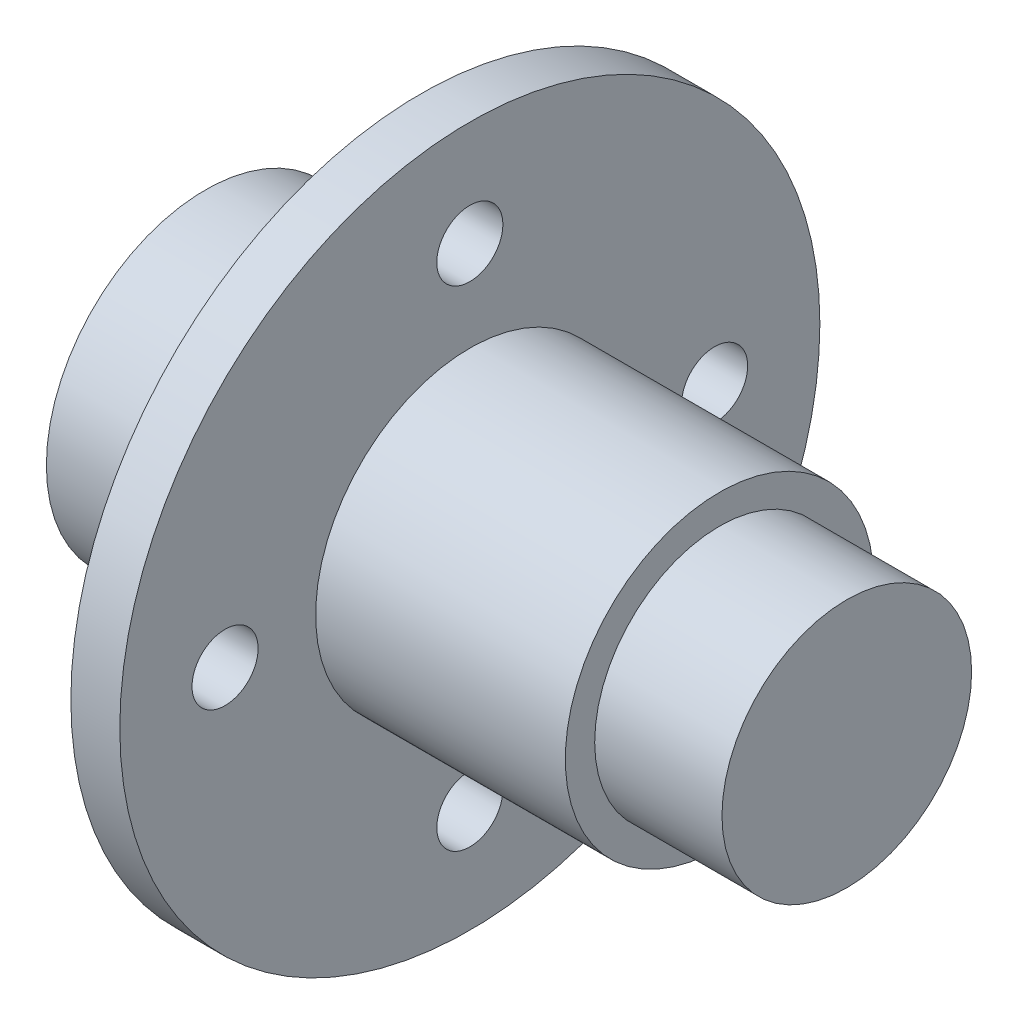
ISO-10303-21;
HEADER;
FILE_DESCRIPTION(('STEP AP214'),'2;1');
FILE_NAME('part.step','',(''),(''),'','','');
FILE_SCHEMA(('AUTOMOTIVE_DESIGN { 1 0 10303 214 1 1 1 1 }'));
ENDSEC;
DATA;
#1=APPLICATION_CONTEXT('core data for automotive mechanical design processes');
#2=APPLICATION_PROTOCOL_DEFINITION('international standard','automotive_design',2000,#1);
#3=PRODUCT_CONTEXT('',#1,'mechanical');
#4=PRODUCT('Part','Part','',(#3));
#5=PRODUCT_RELATED_PRODUCT_CATEGORY('part','',(#4));
#6=PRODUCT_DEFINITION_FORMATION('','',#4);
#7=PRODUCT_DEFINITION_CONTEXT('part definition',#1,'design');
#8=PRODUCT_DEFINITION('design','',#6,#7);
#9=PRODUCT_DEFINITION_SHAPE('','',#8);
#10=(LENGTH_UNIT() NAMED_UNIT(*) SI_UNIT(.MILLI.,.METRE.));
#11=(NAMED_UNIT(*) PLANE_ANGLE_UNIT() SI_UNIT($,.RADIAN.));
#12=(NAMED_UNIT(*) SI_UNIT($,.STERADIAN.) SOLID_ANGLE_UNIT());
#13=UNCERTAINTY_MEASURE_WITH_UNIT(LENGTH_MEASURE(1.E-05),#10,'distance_accuracy_value','');
#14=(GEOMETRIC_REPRESENTATION_CONTEXT(3) GLOBAL_UNCERTAINTY_ASSIGNED_CONTEXT((#13)) GLOBAL_UNIT_ASSIGNED_CONTEXT((#10,
#11,#12)) REPRESENTATION_CONTEXT('',''));
#15=CARTESIAN_POINT('',(0.,0.,0.));
#16=DIRECTION('',(0.,0.,1.));
#17=DIRECTION('',(1.,0.,0.));
#18=AXIS2_PLACEMENT_3D('',#15,#16,#17);
#19=CARTESIAN_POINT('',(-32.4772160216162,0.,0.));
#20=DIRECTION('',(-1.,0.,0.));
#21=DIRECTION('',(0.,0.,1.));
#22=AXIS2_PLACEMENT_3D('',#19,#20,#21);
#23=PLANE('',#22);
#24=CARTESIAN_POINT('',(-32.4772160216162,0.,0.));
#25=DIRECTION('',(1.,0.,0.));
#26=DIRECTION('',(0.,0.,-1.));
#27=AXIS2_PLACEMENT_3D('',#24,#25,#26);
#28=CIRCLE('',#27,32.5);
#29=CARTESIAN_POINT('',(-32.4772160216162,0.,-32.5));
#30=VERTEX_POINT('',#29);
#31=EDGE_CURVE('E10',#30,#30,#28,.T.);
#32=ORIENTED_EDGE('',*,*,#31,.F.);
#33=EDGE_LOOP('',(#32));
#34=FACE_BOUND('',#33,.T.);
#35=ADVANCED_FACE('F33',(#34),#23,.T.);
#36=CARTESIAN_POINT('',(98.5227839783838,0.,0.));
#37=DIRECTION('',(1.,0.,0.));
#38=DIRECTION('',(0.,0.,-1.));
#39=AXIS2_PLACEMENT_3D('',#36,#37,#38);
#40=CYLINDRICAL_SURFACE('',#39,32.5);
#41=ORIENTED_EDGE('',*,*,#31,.T.);
#42=EDGE_LOOP('',(#41));
#43=FACE_BOUND('',#42,.T.);
#44=CARTESIAN_POINT('',(11.5227839783838,0.,0.));
#45=DIRECTION('',(1.,0.,0.));
#46=DIRECTION('',(0.,0.,-1.));
#47=AXIS2_PLACEMENT_3D('',#44,#45,#46);
#48=CIRCLE('',#47,32.5);
#49=CARTESIAN_POINT('',(11.5227839783838,0.,-32.5));
#50=VERTEX_POINT('',#49);
#51=EDGE_CURVE('E39',#50,#50,#48,.T.);
#52=ORIENTED_EDGE('',*,*,#51,.F.);
#53=EDGE_LOOP('',(#52));
#54=FACE_BOUND('',#53,.T.);
#55=ADVANCED_FACE('F135',(#43,#54),#40,.T.);
#56=CARTESIAN_POINT('',(11.5227839783838,32.5,0.));
#57=DIRECTION('',(-1.,0.,0.));
#58=DIRECTION('',(0.,0.,1.));
#59=AXIS2_PLACEMENT_3D('',#56,#57,#58);
#60=PLANE('',#59);
#61=CARTESIAN_POINT('',(11.5227839783838,5.2372220082647E-13,-50.));
#62=DIRECTION('',(-1.,0.,0.));
#63=DIRECTION('',(0.,0.,1.));
#64=AXIS2_PLACEMENT_3D('',#61,#62,#63);
#65=CIRCLE('',#64,6.74999999999999);
#66=CARTESIAN_POINT('',(11.5227839783838,5.2372220082647E-13,-43.25));
#67=VERTEX_POINT('',#66);
#68=EDGE_CURVE('E82',#67,#67,#65,.T.);
#69=ORIENTED_EDGE('',*,*,#68,.F.);
#70=EDGE_LOOP('',(#69));
#71=FACE_BOUND('',#70,.T.);
#72=CARTESIAN_POINT('',(11.5227839783838,-50.,0.));
#73=DIRECTION('',(-1.,0.,0.));
#74=DIRECTION('',(0.,0.,1.));
#75=AXIS2_PLACEMENT_3D('',#72,#73,#74);
#76=CIRCLE('',#75,6.74999999999999);
#77=CARTESIAN_POINT('',(11.5227839783838,-50.,6.74999999999999));
#78=VERTEX_POINT('',#77);
#79=EDGE_CURVE('E76',#78,#78,#76,.T.);
#80=ORIENTED_EDGE('',*,*,#79,.F.);
#81=EDGE_LOOP('',(#80));
#82=FACE_BOUND('',#81,.T.);
#83=CARTESIAN_POINT('',(11.5227839783838,-1.74574066942157E-13,50.));
#84=DIRECTION('',(-1.,0.,0.));
#85=DIRECTION('',(0.,0.,1.));
#86=AXIS2_PLACEMENT_3D('',#83,#84,#85);
#87=CIRCLE('',#86,6.74999999999999);
#88=CARTESIAN_POINT('',(11.5227839783838,-1.74574066942157E-13,56.75));
#89=VERTEX_POINT('',#88);
#90=EDGE_CURVE('E70',#89,#89,#87,.T.);
#91=ORIENTED_EDGE('',*,*,#90,.F.);
#92=EDGE_LOOP('',(#91));
#93=FACE_BOUND('',#92,.T.);
#94=CARTESIAN_POINT('',(11.5227839783838,50.,0.));
#95=DIRECTION('',(-1.,0.,0.));
#96=DIRECTION('',(0.,0.,1.));
#97=AXIS2_PLACEMENT_3D('',#94,#95,#96);
#98=CIRCLE('',#97,6.74999999999999);
#99=CARTESIAN_POINT('',(11.5227839783838,50.,6.74999999999999));
#100=VERTEX_POINT('',#99);
#101=EDGE_CURVE('E64',#100,#100,#98,.T.);
#102=ORIENTED_EDGE('',*,*,#101,.F.);
#103=EDGE_LOOP('',(#102));
#104=FACE_BOUND('',#103,.T.);
#105=ORIENTED_EDGE('',*,*,#51,.T.);
#106=EDGE_LOOP('',(#105));
#107=FACE_BOUND('',#106,.T.);
#108=CARTESIAN_POINT('',(11.5227839783838,0.,0.));
#109=DIRECTION('',(1.,0.,0.));
#110=DIRECTION('',(0.,0.,-1.));
#111=AXIS2_PLACEMENT_3D('',#108,#109,#110);
#112=CIRCLE('',#111,71.5);
#113=CARTESIAN_POINT('',(11.5227839783838,0.,-71.5));
#114=VERTEX_POINT('',#113);
#115=EDGE_CURVE('E43',#114,#114,#112,.T.);
#116=ORIENTED_EDGE('',*,*,#115,.F.);
#117=EDGE_LOOP('',(#116));
#118=FACE_BOUND('',#117,.T.);
#119=ADVANCED_FACE('F140',(#71,#82,#93,#104,#107,#118),#60,.T.);
#120=CARTESIAN_POINT('',(98.5227839783838,0.,0.));
#121=DIRECTION('',(1.,0.,0.));
#122=DIRECTION('',(0.,0.,-1.));
#123=AXIS2_PLACEMENT_3D('',#120,#121,#122);
#124=CYLINDRICAL_SURFACE('',#123,71.5);
#125=ORIENTED_EDGE('',*,*,#115,.T.);
#126=EDGE_LOOP('',(#125));
#127=FACE_BOUND('',#126,.T.);
#128=CARTESIAN_POINT('',(21.5227839783838,0.,0.));
#129=DIRECTION('',(1.,0.,0.));
#130=DIRECTION('',(0.,0.,-1.));
#131=AXIS2_PLACEMENT_3D('',#128,#129,#130);
#132=CIRCLE('',#131,71.5);
#133=CARTESIAN_POINT('',(21.5227839783838,0.,-71.5));
#134=VERTEX_POINT('',#133);
#135=EDGE_CURVE('E47',#134,#134,#132,.T.);
#136=ORIENTED_EDGE('',*,*,#135,.F.);
#137=EDGE_LOOP('',(#136));
#138=FACE_BOUND('',#137,.T.);
#139=ADVANCED_FACE('F95',(#127,#138),#124,.T.);
#140=CARTESIAN_POINT('',(21.5227839783838,71.5,0.));
#141=DIRECTION('',(1.,0.,0.));
#142=DIRECTION('',(0.,0.,-1.));
#143=AXIS2_PLACEMENT_3D('',#140,#141,#142);
#144=PLANE('',#143);
#145=CARTESIAN_POINT('',(21.5227839783838,5.2372220082647E-13,-50.));
#146=DIRECTION('',(1.,0.,0.));
#147=DIRECTION('',(0.,0.,-1.));
#148=AXIS2_PLACEMENT_3D('',#145,#146,#147);
#149=CIRCLE('',#148,6.74999999999999);
#150=CARTESIAN_POINT('',(21.5227839783838,5.2372220082647E-13,-56.75));
#151=VERTEX_POINT('',#150);
#152=EDGE_CURVE('E85',#151,#151,#149,.T.);
#153=ORIENTED_EDGE('',*,*,#152,.F.);
#154=EDGE_LOOP('',(#153));
#155=FACE_BOUND('',#154,.T.);
#156=CARTESIAN_POINT('',(21.5227839783838,-50.,0.));
#157=DIRECTION('',(1.,0.,0.));
#158=DIRECTION('',(0.,0.,-1.));
#159=AXIS2_PLACEMENT_3D('',#156,#157,#158);
#160=CIRCLE('',#159,6.74999999999999);
#161=CARTESIAN_POINT('',(21.5227839783838,-50.,-6.74999999999999));
#162=VERTEX_POINT('',#161);
#163=EDGE_CURVE('E79',#162,#162,#160,.T.);
#164=ORIENTED_EDGE('',*,*,#163,.F.);
#165=EDGE_LOOP('',(#164));
#166=FACE_BOUND('',#165,.T.);
#167=CARTESIAN_POINT('',(21.5227839783838,-1.74574066942157E-13,50.));
#168=DIRECTION('',(1.,0.,0.));
#169=DIRECTION('',(0.,0.,-1.));
#170=AXIS2_PLACEMENT_3D('',#167,#168,#169);
#171=CIRCLE('',#170,6.74999999999999);
#172=CARTESIAN_POINT('',(21.5227839783838,-1.74574066942157E-13,43.25));
#173=VERTEX_POINT('',#172);
#174=EDGE_CURVE('E73',#173,#173,#171,.T.);
#175=ORIENTED_EDGE('',*,*,#174,.F.);
#176=EDGE_LOOP('',(#175));
#177=FACE_BOUND('',#176,.T.);
#178=CARTESIAN_POINT('',(21.5227839783838,50.,0.));
#179=DIRECTION('',(1.,0.,0.));
#180=DIRECTION('',(0.,0.,-1.));
#181=AXIS2_PLACEMENT_3D('',#178,#179,#180);
#182=CIRCLE('',#181,6.74999999999999);
#183=CARTESIAN_POINT('',(21.5227839783838,50.,-6.74999999999999));
#184=VERTEX_POINT('',#183);
#185=EDGE_CURVE('E67',#184,#184,#182,.T.);
#186=ORIENTED_EDGE('',*,*,#185,.F.);
#187=EDGE_LOOP('',(#186));
#188=FACE_BOUND('',#187,.T.);
#189=ORIENTED_EDGE('',*,*,#135,.T.);
#190=EDGE_LOOP('',(#189));
#191=FACE_BOUND('',#190,.T.);
#192=CARTESIAN_POINT('',(21.5227839783838,0.,0.));
#193=DIRECTION('',(1.,0.,0.));
#194=DIRECTION('',(0.,0.,-1.));
#195=AXIS2_PLACEMENT_3D('',#192,#193,#194);
#196=CIRCLE('',#195,31.5);
#197=CARTESIAN_POINT('',(21.5227839783838,0.,-31.5));
#198=VERTEX_POINT('',#197);
#199=EDGE_CURVE('E52',#198,#198,#196,.T.);
#200=ORIENTED_EDGE('',*,*,#199,.F.);
#201=EDGE_LOOP('',(#200));
#202=FACE_BOUND('',#201,.T.);
#203=ADVANCED_FACE('F91',(#155,#166,#177,#188,#191,#202),#144,.T.);
#204=CARTESIAN_POINT('',(98.5227839783838,0.,0.));
#205=DIRECTION('',(1.,0.,0.));
#206=DIRECTION('',(0.,0.,-1.));
#207=AXIS2_PLACEMENT_3D('',#204,#205,#206);
#208=CYLINDRICAL_SURFACE('',#207,31.5);
#209=ORIENTED_EDGE('',*,*,#199,.T.);
#210=EDGE_LOOP('',(#209));
#211=FACE_BOUND('',#210,.T.);
#212=CARTESIAN_POINT('',(72.5227839783838,0.,0.));
#213=DIRECTION('',(1.,0.,0.));
#214=DIRECTION('',(0.,0.,-1.));
#215=AXIS2_PLACEMENT_3D('',#212,#213,#214);
#216=CIRCLE('',#215,31.5);
#217=CARTESIAN_POINT('',(72.5227839783838,0.,-31.5));
#218=VERTEX_POINT('',#217);
#219=EDGE_CURVE('E55',#218,#218,#216,.T.);
#220=ORIENTED_EDGE('',*,*,#219,.F.);
#221=EDGE_LOOP('',(#220));
#222=FACE_BOUND('',#221,.T.);
#223=ADVANCED_FACE('F94',(#211,#222),#208,.T.);
#224=CARTESIAN_POINT('',(72.5227839783838,31.5,0.));
#225=DIRECTION('',(1.,0.,0.));
#226=DIRECTION('',(0.,0.,-1.));
#227=AXIS2_PLACEMENT_3D('',#224,#225,#226);
#228=PLANE('',#227);
#229=ORIENTED_EDGE('',*,*,#219,.T.);
#230=EDGE_LOOP('',(#229));
#231=FACE_BOUND('',#230,.T.);
#232=CARTESIAN_POINT('',(72.5227839783838,0.,0.));
#233=DIRECTION('',(1.,0.,0.));
#234=DIRECTION('',(0.,0.,-1.));
#235=AXIS2_PLACEMENT_3D('',#232,#233,#234);
#236=CIRCLE('',#235,25.5);
#237=CARTESIAN_POINT('',(72.5227839783838,0.,-25.5));
#238=VERTEX_POINT('',#237);
#239=EDGE_CURVE('E58',#238,#238,#236,.T.);
#240=ORIENTED_EDGE('',*,*,#239,.F.);
#241=EDGE_LOOP('',(#240));
#242=FACE_BOUND('',#241,.T.);
#243=ADVANCED_FACE('F109',(#231,#242),#228,.T.);
#244=CARTESIAN_POINT('',(98.5227839783838,0.,0.));
#245=DIRECTION('',(1.,0.,0.));
#246=DIRECTION('',(0.,0.,-1.));
#247=AXIS2_PLACEMENT_3D('',#244,#245,#246);
#248=CYLINDRICAL_SURFACE('',#247,25.5);
#249=ORIENTED_EDGE('',*,*,#239,.T.);
#250=EDGE_LOOP('',(#249));
#251=FACE_BOUND('',#250,.T.);
#252=CARTESIAN_POINT('',(98.5227839783838,0.,0.));
#253=DIRECTION('',(1.,0.,0.));
#254=DIRECTION('',(0.,0.,-1.));
#255=AXIS2_PLACEMENT_3D('',#252,#253,#254);
#256=CIRCLE('',#255,25.5);
#257=CARTESIAN_POINT('',(98.5227839783838,0.,-25.5));
#258=VERTEX_POINT('',#257);
#259=EDGE_CURVE('E61',#258,#258,#256,.T.);
#260=ORIENTED_EDGE('',*,*,#259,.F.);
#261=EDGE_LOOP('',(#260));
#262=FACE_BOUND('',#261,.T.);
#263=ADVANCED_FACE('F115',(#251,#262),#248,.T.);
#264=CARTESIAN_POINT('',(98.5227839783838,25.5,0.));
#265=DIRECTION('',(1.,0.,0.));
#266=DIRECTION('',(0.,0.,-1.));
#267=AXIS2_PLACEMENT_3D('',#264,#265,#266);
#268=PLANE('',#267);
#269=ORIENTED_EDGE('',*,*,#259,.T.);
#270=EDGE_LOOP('',(#269));
#271=FACE_BOUND('',#270,.T.);
#272=ADVANCED_FACE('F121',(#271),#268,.T.);
#273=CARTESIAN_POINT('',(21.5227839783838,50.,0.));
#274=DIRECTION('',(1.,0.,0.));
#275=DIRECTION('',(0.,0.,-1.));
#276=AXIS2_PLACEMENT_3D('',#273,#274,#275);
#277=CYLINDRICAL_SURFACE('',#276,6.74999999999999);
#278=ORIENTED_EDGE('',*,*,#101,.T.);
#279=EDGE_LOOP('',(#278));
#280=FACE_BOUND('',#279,.T.);
#281=ORIENTED_EDGE('',*,*,#185,.T.);
#282=EDGE_LOOP('',(#281));
#283=FACE_BOUND('',#282,.T.);
#284=ADVANCED_FACE('F126',(#280,#283),#277,.F.);
#285=CARTESIAN_POINT('',(21.5227839783838,-1.74574066942157E-13,50.));
#286=DIRECTION('',(1.,0.,0.));
#287=DIRECTION('',(0.,0.,-1.));
#288=AXIS2_PLACEMENT_3D('',#285,#286,#287);
#289=CYLINDRICAL_SURFACE('',#288,6.74999999999999);
#290=ORIENTED_EDGE('',*,*,#90,.T.);
#291=EDGE_LOOP('',(#290));
#292=FACE_BOUND('',#291,.T.);
#293=ORIENTED_EDGE('',*,*,#174,.T.);
#294=EDGE_LOOP('',(#293));
#295=FACE_BOUND('',#294,.T.);
#296=ADVANCED_FACE('F131',(#292,#295),#289,.F.);
#297=CARTESIAN_POINT('',(21.5227839783838,-50.,0.));
#298=DIRECTION('',(1.,0.,0.));
#299=DIRECTION('',(0.,0.,-1.));
#300=AXIS2_PLACEMENT_3D('',#297,#298,#299);
#301=CYLINDRICAL_SURFACE('',#300,6.74999999999999);
#302=ORIENTED_EDGE('',*,*,#79,.T.);
#303=EDGE_LOOP('',(#302));
#304=FACE_BOUND('',#303,.T.);
#305=ORIENTED_EDGE('',*,*,#163,.T.);
#306=EDGE_LOOP('',(#305));
#307=FACE_BOUND('',#306,.T.);
#308=ADVANCED_FACE('F212',(#304,#307),#301,.F.);
#309=CARTESIAN_POINT('',(21.5227839783838,5.2372220082647E-13,-50.));
#310=DIRECTION('',(1.,0.,0.));
#311=DIRECTION('',(0.,0.,-1.));
#312=AXIS2_PLACEMENT_3D('',#309,#310,#311);
#313=CYLINDRICAL_SURFACE('',#312,6.74999999999999);
#314=ORIENTED_EDGE('',*,*,#68,.T.);
#315=EDGE_LOOP('',(#314));
#316=FACE_BOUND('',#315,.T.);
#317=ORIENTED_EDGE('',*,*,#152,.T.);
#318=EDGE_LOOP('',(#317));
#319=FACE_BOUND('',#318,.T.);
#320=ADVANCED_FACE('F89',(#316,#319),#313,.F.);
#321=CLOSED_SHELL('',(#35,#55,#119,#139,#203,#223,#243,#263,#272,#284,#296,#308,#320));
#322=MANIFOLD_SOLID_BREP('B2',#321);
#323=ADVANCED_BREP_SHAPE_REPRESENTATION('',(#18,#322),#14);
#324=SHAPE_DEFINITION_REPRESENTATION(#9,#323);
ENDSEC;
END-ISO-10303-21;
